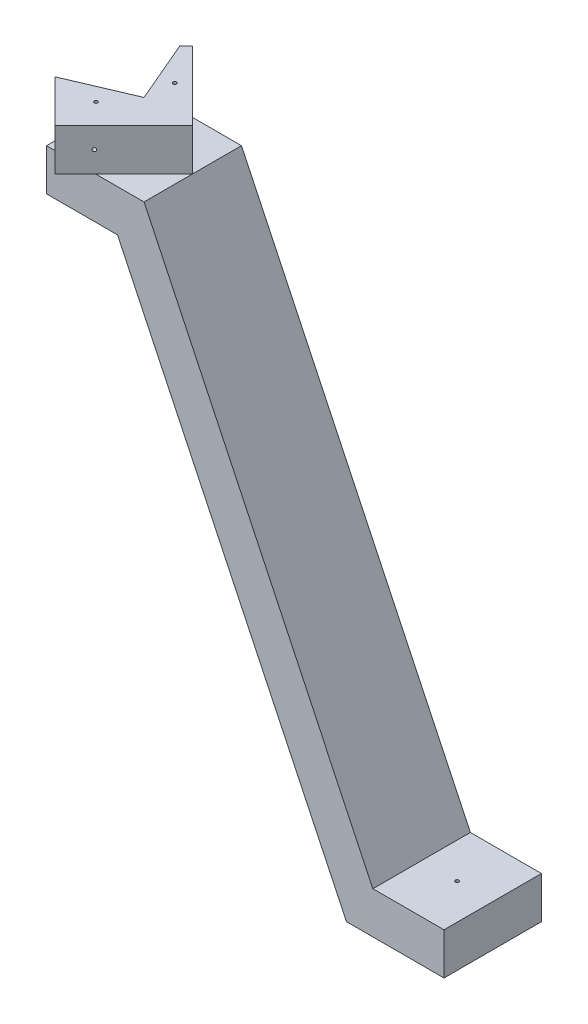
ISO-10303-21;
HEADER;
FILE_DESCRIPTION(('STEP AP214'),'2;1');
FILE_NAME('part.step','',(''),(''),'','','');
FILE_SCHEMA(('AUTOMOTIVE_DESIGN { 1 0 10303 214 1 1 1 1 }'));
ENDSEC;
DATA;
#1=APPLICATION_CONTEXT('core data for automotive mechanical design processes');
#2=APPLICATION_PROTOCOL_DEFINITION('international standard','automotive_design',2000,#1);
#3=PRODUCT_CONTEXT('',#1,'mechanical');
#4=PRODUCT('Part','Part','',(#3));
#5=PRODUCT_RELATED_PRODUCT_CATEGORY('part','',(#4));
#6=PRODUCT_DEFINITION_FORMATION('','',#4);
#7=PRODUCT_DEFINITION_CONTEXT('part definition',#1,'design');
#8=PRODUCT_DEFINITION('design','',#6,#7);
#9=PRODUCT_DEFINITION_SHAPE('','',#8);
#10=(LENGTH_UNIT() NAMED_UNIT(*) SI_UNIT(.MILLI.,.METRE.));
#11=(NAMED_UNIT(*) PLANE_ANGLE_UNIT() SI_UNIT($,.RADIAN.));
#12=(NAMED_UNIT(*) SI_UNIT($,.STERADIAN.) SOLID_ANGLE_UNIT());
#13=UNCERTAINTY_MEASURE_WITH_UNIT(LENGTH_MEASURE(1.E-05),#10,'distance_accuracy_value','');
#14=(GEOMETRIC_REPRESENTATION_CONTEXT(3) GLOBAL_UNCERTAINTY_ASSIGNED_CONTEXT((#13)) GLOBAL_UNIT_ASSIGNED_CONTEXT((#10,
#11,#12)) REPRESENTATION_CONTEXT('',''));
#15=CARTESIAN_POINT('',(0.,0.,0.));
#16=DIRECTION('',(0.,0.,1.));
#17=DIRECTION('',(1.,0.,0.));
#18=AXIS2_PLACEMENT_3D('',#15,#16,#17);
#19=CARTESIAN_POINT('',(-184.749471519788,476.25,44.45));
#20=DIRECTION('',(0.,-1.,0.));
#21=DIRECTION('',(0.,0.,-1.));
#22=AXIS2_PLACEMENT_3D('',#19,#20,#21);
#23=PLANE('',#22);
#24=DIRECTION('',(-0.707106781186549,0.,-0.707106781186546));
#25=VECTOR('',#24,1.);
#26=CARTESIAN_POINT('',(-247.611264367272,476.25,-62.8617928474839));
#27=LINE('',#26,#25);
#28=CARTESIAN_POINT('',(-184.749471519788,476.25,0.));
#29=VERTEX_POINT('',#28);
#30=CARTESIAN_POINT('',(-229.199471519788,476.25,-44.45));
#31=VERTEX_POINT('',#30);
#32=EDGE_CURVE('E69',#29,#31,#27,.T.);
#33=ORIENTED_EDGE('',*,*,#32,.F.);
#34=DIRECTION('',(0.,0.,-1.));
#35=VECTOR('',#34,1.);
#36=CARTESIAN_POINT('',(-184.749471519788,476.25,44.45));
#37=LINE('',#36,#35);
#38=CARTESIAN_POINT('',(-184.749471519788,476.25,-44.45));
#39=VERTEX_POINT('',#38);
#40=EDGE_CURVE('E334',#29,#39,#37,.T.);
#41=ORIENTED_EDGE('',*,*,#40,.T.);
#42=DIRECTION('',(-1.,0.,0.));
#43=VECTOR('',#42,1.);
#44=CARTESIAN_POINT('',(-184.749471519788,476.25,-44.45));
#45=LINE('',#44,#43);
#46=EDGE_CURVE('E310',#39,#31,#45,.T.);
#47=ORIENTED_EDGE('',*,*,#46,.T.);
#48=EDGE_LOOP('',(#33,#41,#47));
#49=FACE_BOUND('',#48,.T.);
#50=ADVANCED_FACE('F39',(#49),#23,.F.);
#51=DIRECTION('',(0.707106781186549,0.,-0.707106781186546));
#52=VECTOR('',#51,1.);
#53=CARTESIAN_POINT('',(-184.749471519788,476.25,0.));
#54=LINE('',#53,#52);
#55=CARTESIAN_POINT('',(-229.199471519788,476.25,44.45));
#56=VERTEX_POINT('',#55);
#57=EDGE_CURVE('E54',#56,#29,#54,.T.);
#58=ORIENTED_EDGE('',*,*,#57,.F.);
#59=DIRECTION('',(-1.,0.,0.));
#60=VECTOR('',#59,1.);
#61=CARTESIAN_POINT('',(-184.749471519788,476.25,44.45));
#62=LINE('',#61,#60);
#63=CARTESIAN_POINT('',(-184.749471519788,476.25,44.45));
#64=VERTEX_POINT('',#63);
#65=EDGE_CURVE('E281',#64,#56,#62,.T.);
#66=ORIENTED_EDGE('',*,*,#65,.F.);
#67=EDGE_CURVE('E335',#64,#29,#37,.T.);
#68=ORIENTED_EDGE('',*,*,#67,.T.);
#69=EDGE_LOOP('',(#58,#66,#68));
#70=FACE_BOUND('',#69,.T.);
#71=ADVANCED_FACE('F452',(#70),#23,.F.);
#72=DIRECTION('',(0.707106781186549,0.,0.707106781186546));
#73=VECTOR('',#72,1.);
#74=CARTESIAN_POINT('',(-247.611264367272,476.25,62.8617928474839));
#75=LINE('',#74,#73);
#76=CARTESIAN_POINT('',(-273.649471519788,476.25,36.8235856949683));
#77=VERTEX_POINT('',#76);
#78=CARTESIAN_POINT('',(-266.023057214756,476.25,44.45));
#79=VERTEX_POINT('',#78);
#80=EDGE_CURVE('E239',#77,#79,#75,.T.);
#81=ORIENTED_EDGE('',*,*,#80,.F.);
#82=DIRECTION('',(0.,0.,-1.));
#83=VECTOR('',#82,1.);
#84=CARTESIAN_POINT('',(-273.649471519788,476.25,44.45));
#85=LINE('',#84,#83);
#86=CARTESIAN_POINT('',(-273.649471519788,476.25,44.45));
#87=VERTEX_POINT('',#86);
#88=EDGE_CURVE('E330',#87,#77,#85,.T.);
#89=ORIENTED_EDGE('',*,*,#88,.F.);
#90=EDGE_CURVE('E280',#79,#87,#62,.T.);
#91=ORIENTED_EDGE('',*,*,#90,.F.);
#92=EDGE_LOOP('',(#81,#89,#91));
#93=FACE_BOUND('',#92,.T.);
#94=ADVANCED_FACE('F409',(#93),#23,.F.);
#95=CARTESIAN_POINT('',(88.9,0.,44.45));
#96=DIRECTION('',(0.,1.,0.));
#97=DIRECTION('',(0.,0.,1.));
#98=AXIS2_PLACEMENT_3D('',#95,#96,#97);
#99=PLANE('',#98);
#100=CARTESIAN_POINT('',(56.474328480212,0.,0.));
#101=DIRECTION('',(0.,1.,0.));
#102=DIRECTION('',(0.,0.,1.));
#103=AXIS2_PLACEMENT_3D('',#100,#101,#102);
#104=CIRCLE('',#103,1.58749999999999);
#105=CARTESIAN_POINT('',(56.474328480212,0.,1.58749999999999));
#106=VERTEX_POINT('',#105);
#107=EDGE_CURVE('E261',#106,#106,#104,.T.);
#108=ORIENTED_EDGE('',*,*,#107,.T.);
#109=EDGE_LOOP('',(#108));
#110=FACE_BOUND('',#109,.T.);
#111=DIRECTION('',(1.,0.,0.));
#112=VECTOR('',#111,1.);
#113=CARTESIAN_POINT('',(88.9,0.,-44.45));
#114=LINE('',#113,#112);
#115=CARTESIAN_POINT('',(0.,0.,-44.45));
#116=VERTEX_POINT('',#115);
#117=CARTESIAN_POINT('',(88.9,0.,-44.45));
#118=VERTEX_POINT('',#117);
#119=EDGE_CURVE('E265',#116,#118,#114,.T.);
#120=ORIENTED_EDGE('',*,*,#119,.T.);
#121=DIRECTION('',(0.,0.,-1.));
#122=VECTOR('',#121,1.);
#123=CARTESIAN_POINT('',(88.9,0.,44.45));
#124=LINE('',#123,#122);
#125=CARTESIAN_POINT('',(88.9,0.,44.45));
#126=VERTEX_POINT('',#125);
#127=EDGE_CURVE('E347',#126,#118,#124,.T.);
#128=ORIENTED_EDGE('',*,*,#127,.F.);
#129=DIRECTION('',(1.,0.,0.));
#130=VECTOR('',#129,1.);
#131=CARTESIAN_POINT('',(88.9,0.,44.45));
#132=LINE('',#131,#130);
#133=CARTESIAN_POINT('',(0.,0.,44.45));
#134=VERTEX_POINT('',#133);
#135=EDGE_CURVE('E266',#134,#126,#132,.T.);
#136=ORIENTED_EDGE('',*,*,#135,.F.);
#137=DIRECTION('',(0.,0.,-1.));
#138=VECTOR('',#137,1.);
#139=CARTESIAN_POINT('',(0.,0.,44.45));
#140=LINE('',#139,#138);
#141=EDGE_CURVE('E295',#134,#116,#140,.T.);
#142=ORIENTED_EDGE('',*,*,#141,.T.);
#143=EDGE_LOOP('',(#120,#128,#136,#142));
#144=FACE_BOUND('',#143,.T.);
#145=ADVANCED_FACE('F41',(#110,#144),#99,.F.);
#146=CARTESIAN_POINT('',(88.9,38.1,44.45));
#147=DIRECTION('',(-1.,0.,0.));
#148=DIRECTION('',(0.,0.,1.));
#149=AXIS2_PLACEMENT_3D('',#146,#147,#148);
#150=PLANE('',#149);
#151=DIRECTION('',(0.,1.,0.));
#152=VECTOR('',#151,1.);
#153=CARTESIAN_POINT('',(88.9,38.1,-44.45));
#154=LINE('',#153,#152);
#155=CARTESIAN_POINT('',(88.9,38.1,-44.45));
#156=VERTEX_POINT('',#155);
#157=EDGE_CURVE('E299',#118,#156,#154,.T.);
#158=ORIENTED_EDGE('',*,*,#157,.T.);
#159=DIRECTION('',(0.,0.,-1.));
#160=VECTOR('',#159,1.);
#161=CARTESIAN_POINT('',(88.9,38.1,44.45));
#162=LINE('',#161,#160);
#163=CARTESIAN_POINT('',(88.9,38.1,44.45));
#164=VERTEX_POINT('',#163);
#165=EDGE_CURVE('E343',#164,#156,#162,.T.);
#166=ORIENTED_EDGE('',*,*,#165,.F.);
#167=DIRECTION('',(0.,1.,0.));
#168=VECTOR('',#167,1.);
#169=CARTESIAN_POINT('',(88.9,38.1,44.45));
#170=LINE('',#169,#168);
#171=EDGE_CURVE('E270',#126,#164,#170,.T.);
#172=ORIENTED_EDGE('',*,*,#171,.F.);
#173=ORIENTED_EDGE('',*,*,#127,.T.);
#174=EDGE_LOOP('',(#158,#166,#172,#173));
#175=FACE_BOUND('',#174,.T.);
#176=ADVANCED_FACE('F441',(#175),#150,.F.);
#177=CARTESIAN_POINT('',(24.0486569604239,38.1,44.45));
#178=DIRECTION('',(0.,-1.,0.));
#179=DIRECTION('',(0.,0.,-1.));
#180=AXIS2_PLACEMENT_3D('',#177,#178,#179);
#181=PLANE('',#180);
#182=CARTESIAN_POINT('',(56.474328480212,38.1,0.));
#183=DIRECTION('',(0.,1.,0.));
#184=DIRECTION('',(0.,0.,1.));
#185=AXIS2_PLACEMENT_3D('',#182,#183,#184);
#186=CIRCLE('',#185,1.58749999999999);
#187=CARTESIAN_POINT('',(56.474328480212,38.1,1.58749999999999));
#188=VERTEX_POINT('',#187);
#189=EDGE_CURVE('E257',#188,#188,#186,.T.);
#190=ORIENTED_EDGE('',*,*,#189,.F.);
#191=EDGE_LOOP('',(#190));
#192=FACE_BOUND('',#191,.T.);
#193=DIRECTION('',(-1.,0.,0.));
#194=VECTOR('',#193,1.);
#195=CARTESIAN_POINT('',(24.0486569604239,38.1,-44.45));
#196=LINE('',#195,#194);
#197=CARTESIAN_POINT('',(24.0486569604239,38.1,-44.45));
#198=VERTEX_POINT('',#197);
#199=EDGE_CURVE('E302',#156,#198,#196,.T.);
#200=ORIENTED_EDGE('',*,*,#199,.T.);
#201=DIRECTION('',(0.,0.,-1.));
#202=VECTOR('',#201,1.);
#203=CARTESIAN_POINT('',(24.0486569604239,38.1,44.45));
#204=LINE('',#203,#202);
#205=CARTESIAN_POINT('',(24.0486569604239,38.1,44.45));
#206=VERTEX_POINT('',#205);
#207=EDGE_CURVE('E339',#206,#198,#204,.T.);
#208=ORIENTED_EDGE('',*,*,#207,.F.);
#209=DIRECTION('',(-1.,0.,0.));
#210=VECTOR('',#209,1.);
#211=CARTESIAN_POINT('',(24.0486569604239,38.1,44.45));
#212=LINE('',#211,#210);
#213=EDGE_CURVE('E274',#164,#206,#212,.T.);
#214=ORIENTED_EDGE('',*,*,#213,.F.);
#215=ORIENTED_EDGE('',*,*,#165,.T.);
#216=EDGE_LOOP('',(#200,#208,#214,#215));
#217=FACE_BOUND('',#216,.T.);
#218=ADVANCED_FACE('F444',(#192,#217),#181,.F.);
#219=CARTESIAN_POINT('',(-184.749471519788,476.25,44.45));
#220=DIRECTION('',(-0.902736301232063,-0.4301943403136,0.));
#221=DIRECTION('',(0.4301943403136,-0.902736301232063,0.));
#222=AXIS2_PLACEMENT_3D('',#219,#220,#221);
#223=PLANE('',#222);
#224=DIRECTION('',(-0.4301943403136,0.902736301232063,0.));
#225=VECTOR('',#224,1.);
#226=CARTESIAN_POINT('',(-184.749471519788,476.25,-44.45));
#227=LINE('',#226,#225);
#228=EDGE_CURVE('E305',#198,#39,#227,.T.);
#229=ORIENTED_EDGE('',*,*,#228,.T.);
#230=ORIENTED_EDGE('',*,*,#40,.F.);
#231=ORIENTED_EDGE('',*,*,#67,.F.);
#232=DIRECTION('',(-0.4301943403136,0.902736301232063,0.));
#233=VECTOR('',#232,1.);
#234=CARTESIAN_POINT('',(-184.749471519788,476.25,44.45));
#235=LINE('',#234,#233);
#236=EDGE_CURVE('E277',#206,#64,#235,.T.);
#237=ORIENTED_EDGE('',*,*,#236,.F.);
#238=ORIENTED_EDGE('',*,*,#207,.T.);
#239=EDGE_LOOP('',(#229,#230,#231,#237,#238));
#240=FACE_BOUND('',#239,.T.);
#241=ADVANCED_FACE('F449',(#240),#223,.F.);
#242=CARTESIAN_POINT('',(-273.649471519788,476.25,44.45));
#243=DIRECTION('',(1.,0.,0.));
#244=DIRECTION('',(0.,0.,-1.));
#245=AXIS2_PLACEMENT_3D('',#242,#243,#244);
#246=PLANE('',#245);
#247=CARTESIAN_POINT('',(-273.649471519788,476.25,18.9769560653847));
#248=VERTEX_POINT('',#247);
#249=EDGE_CURVE('E329',#77,#248,#85,.T.);
#250=ORIENTED_EDGE('',*,*,#249,.T.);
#251=DIRECTION('',(0.,-1.,0.));
#252=VECTOR('',#251,1.);
#253=CARTESIAN_POINT('',(-273.649471519788,476.25,18.9769560653847));
#254=LINE('',#253,#252);
#255=CARTESIAN_POINT('',(-273.649471519788,438.15,18.9769560653847));
#256=VERTEX_POINT('',#255);
#257=EDGE_CURVE('E211',#248,#256,#254,.T.);
#258=ORIENTED_EDGE('',*,*,#257,.T.);
#259=DIRECTION('',(0.,0.,-1.));
#260=VECTOR('',#259,1.);
#261=CARTESIAN_POINT('',(-273.649471519788,438.15,44.45));
#262=LINE('',#261,#260);
#263=CARTESIAN_POINT('',(-273.649471519788,438.15,44.45));
#264=VERTEX_POINT('',#263);
#265=EDGE_CURVE('E325',#264,#256,#262,.T.);
#266=ORIENTED_EDGE('',*,*,#265,.F.);
#267=DIRECTION('',(0.,-1.,0.));
#268=VECTOR('',#267,1.);
#269=CARTESIAN_POINT('',(-273.649471519788,476.25,44.45));
#270=LINE('',#269,#268);
#271=EDGE_CURVE('E285',#87,#264,#270,.T.);
#272=ORIENTED_EDGE('',*,*,#271,.F.);
#273=ORIENTED_EDGE('',*,*,#88,.T.);
#274=EDGE_LOOP('',(#250,#258,#266,#272,#273));
#275=FACE_BOUND('',#274,.T.);
#276=ADVANCED_FACE('F387',(#275),#246,.F.);
#277=CARTESIAN_POINT('',(-273.649471519788,438.15,44.45));
#278=DIRECTION('',(0.,1.,0.));
#279=DIRECTION('',(-1.,0.,0.));
#280=AXIS2_PLACEMENT_3D('',#277,#278,#279);
#281=PLANE('',#280);
#282=CARTESIAN_POINT('',(-247.611264367272,438.15,25.4));
#283=DIRECTION('',(0.,-1.,0.));
#284=DIRECTION('',(0.,0.,-1.));
#285=AXIS2_PLACEMENT_3D('',#282,#283,#284);
#286=CIRCLE('',#285,1.58749999999999);
#287=CARTESIAN_POINT('',(-247.611264367272,438.15,23.8125));
#288=VERTEX_POINT('',#287);
#289=EDGE_CURVE('E375',#288,#288,#286,.T.);
#290=ORIENTED_EDGE('',*,*,#289,.F.);
#291=EDGE_LOOP('',(#290));
#292=FACE_BOUND('',#291,.T.);
#293=CARTESIAN_POINT('',(-226.578128480212,438.15,-25.4));
#294=DIRECTION('',(0.,-1.,0.));
#295=DIRECTION('',(0.,0.,-1.));
#296=AXIS2_PLACEMENT_3D('',#293,#294,#295);
#297=CIRCLE('',#296,1.58749999999999);
#298=CARTESIAN_POINT('',(-226.578128480212,438.15,-26.9875));
#299=VERTEX_POINT('',#298);
#300=EDGE_CURVE('E365',#299,#299,#297,.T.);
#301=ORIENTED_EDGE('',*,*,#300,.F.);
#302=EDGE_LOOP('',(#301));
#303=FACE_BOUND('',#302,.T.);
#304=ORIENTED_EDGE('',*,*,#265,.T.);
#305=DIRECTION('',(0.919691342834383,0.,-0.392642119385438));
#306=VECTOR('',#305,1.);
#307=CARTESIAN_POINT('',(-282.84803115672,438.15,22.9040800720184));
#308=LINE('',#307,#306);
#309=CARTESIAN_POINT('',(-229.199471519788,438.15,0.));
#310=VERTEX_POINT('',#309);
#311=EDGE_CURVE('E215',#256,#310,#308,.T.);
#312=ORIENTED_EDGE('',*,*,#311,.T.);
#313=DIRECTION('',(-0.392642119385441,0.,-0.919691342834382));
#314=VECTOR('',#313,1.);
#315=CARTESIAN_POINT('',(-220.000911882857,438.15,21.5459199279814));
#316=LINE('',#315,#314);
#317=CARTESIAN_POINT('',(-248.176427585173,438.15,-44.45));
#318=VERTEX_POINT('',#317);
#319=EDGE_CURVE('E170',#310,#318,#316,.T.);
#320=ORIENTED_EDGE('',*,*,#319,.T.);
#321=DIRECTION('',(1.,0.,0.));
#322=VECTOR('',#321,1.);
#323=CARTESIAN_POINT('',(-273.649471519788,438.15,-44.45));
#324=LINE('',#323,#322);
#325=CARTESIAN_POINT('',(-208.798128480212,438.15,-44.45));
#326=VERTEX_POINT('',#325);
#327=EDGE_CURVE('E313',#318,#326,#324,.T.);
#328=ORIENTED_EDGE('',*,*,#327,.T.);
#329=DIRECTION('',(0.,0.,-1.));
#330=VECTOR('',#329,1.);
#331=CARTESIAN_POINT('',(-208.798128480212,438.15,44.45));
#332=LINE('',#331,#330);
#333=CARTESIAN_POINT('',(-208.798128480212,438.15,44.45));
#334=VERTEX_POINT('',#333);
#335=EDGE_CURVE('E321',#334,#326,#332,.T.);
#336=ORIENTED_EDGE('',*,*,#335,.F.);
#337=DIRECTION('',(1.,0.,0.));
#338=VECTOR('',#337,1.);
#339=CARTESIAN_POINT('',(-273.649471519788,438.15,44.45));
#340=LINE('',#339,#338);
#341=EDGE_CURVE('E289',#264,#334,#340,.T.);
#342=ORIENTED_EDGE('',*,*,#341,.F.);
#343=EDGE_LOOP('',(#304,#312,#320,#328,#336,#342));
#344=FACE_BOUND('',#343,.T.);
#345=ADVANCED_FACE('F383',(#292,#303,#344),#281,.F.);
#346=CARTESIAN_POINT('',(0.,0.,44.45));
#347=DIRECTION('',(0.902736301232063,0.4301943403136,0.));
#348=DIRECTION('',(-0.4301943403136,0.902736301232063,0.));
#349=AXIS2_PLACEMENT_3D('',#346,#347,#348);
#350=PLANE('',#349);
#351=DIRECTION('',(0.4301943403136,-0.902736301232063,0.));
#352=VECTOR('',#351,1.);
#353=CARTESIAN_POINT('',(0.,0.,-44.45));
#354=LINE('',#353,#352);
#355=EDGE_CURVE('E271',#326,#116,#354,.T.);
#356=ORIENTED_EDGE('',*,*,#355,.T.);
#357=ORIENTED_EDGE('',*,*,#141,.F.);
#358=DIRECTION('',(0.4301943403136,-0.902736301232063,0.));
#359=VECTOR('',#358,1.);
#360=CARTESIAN_POINT('',(0.,0.,44.45));
#361=LINE('',#360,#359);
#362=EDGE_CURVE('E292',#334,#134,#361,.T.);
#363=ORIENTED_EDGE('',*,*,#362,.F.);
#364=ORIENTED_EDGE('',*,*,#335,.T.);
#365=EDGE_LOOP('',(#356,#357,#363,#364));
#366=FACE_BOUND('',#365,.T.);
#367=ADVANCED_FACE('F386',(#366),#350,.F.);
#368=CARTESIAN_POINT('',(0.,0.,44.45));
#369=DIRECTION('',(0.,0.,1.));
#370=DIRECTION('',(1.,0.,0.));
#371=AXIS2_PLACEMENT_3D('',#368,#369,#370);
#372=PLANE('',#371);
#373=ORIENTED_EDGE('',*,*,#135,.T.);
#374=ORIENTED_EDGE('',*,*,#171,.T.);
#375=ORIENTED_EDGE('',*,*,#213,.T.);
#376=ORIENTED_EDGE('',*,*,#236,.T.);
#377=ORIENTED_EDGE('',*,*,#65,.T.);
#378=EDGE_CURVE('E286',#56,#79,#62,.T.);
#379=ORIENTED_EDGE('',*,*,#378,.T.);
#380=ORIENTED_EDGE('',*,*,#90,.T.);
#381=ORIENTED_EDGE('',*,*,#271,.T.);
#382=ORIENTED_EDGE('',*,*,#341,.T.);
#383=ORIENTED_EDGE('',*,*,#362,.T.);
#384=EDGE_LOOP('',(#373,#374,#375,#376,#377,#379,#380,#381,#382,#383));
#385=FACE_BOUND('',#384,.T.);
#386=ADVANCED_FACE('F427',(#385),#372,.T.);
#387=CARTESIAN_POINT('',(0.,0.,-44.45));
#388=DIRECTION('',(0.,0.,1.));
#389=DIRECTION('',(1.,0.,0.));
#390=AXIS2_PLACEMENT_3D('',#387,#388,#389);
#391=PLANE('',#390);
#392=ORIENTED_EDGE('',*,*,#327,.F.);
#393=DIRECTION('',(0.,1.,0.));
#394=VECTOR('',#393,1.);
#395=CARTESIAN_POINT('',(-248.176427585173,0.,-44.45));
#396=LINE('',#395,#394);
#397=CARTESIAN_POINT('',(-248.176427585173,476.25,-44.45));
#398=VERTEX_POINT('',#397);
#399=EDGE_CURVE('E200',#318,#398,#396,.T.);
#400=ORIENTED_EDGE('',*,*,#399,.T.);
#401=EDGE_CURVE('E309',#31,#398,#45,.T.);
#402=ORIENTED_EDGE('',*,*,#401,.F.);
#403=ORIENTED_EDGE('',*,*,#46,.F.);
#404=ORIENTED_EDGE('',*,*,#228,.F.);
#405=ORIENTED_EDGE('',*,*,#199,.F.);
#406=ORIENTED_EDGE('',*,*,#157,.F.);
#407=ORIENTED_EDGE('',*,*,#119,.F.);
#408=ORIENTED_EDGE('',*,*,#355,.F.);
#409=EDGE_LOOP('',(#392,#400,#402,#403,#404,#405,#406,#407,#408));
#410=FACE_BOUND('',#409,.T.);
#411=ADVANCED_FACE('F465',(#410),#391,.F.);
#412=CARTESIAN_POINT('',(56.474328480212,38.1,0.));
#413=DIRECTION('',(0.,1.,0.));
#414=DIRECTION('',(0.,0.,1.));
#415=AXIS2_PLACEMENT_3D('',#412,#413,#414);
#416=CYLINDRICAL_SURFACE('',#415,1.58749999999999);
#417=ORIENTED_EDGE('',*,*,#107,.F.);
#418=EDGE_LOOP('',(#417));
#419=FACE_BOUND('',#418,.T.);
#420=ORIENTED_EDGE('',*,*,#189,.T.);
#421=EDGE_LOOP('',(#420));
#422=FACE_BOUND('',#421,.T.);
#423=ADVANCED_FACE('F486',(#419,#422),#416,.F.);
#424=CARTESIAN_POINT('',(0.,476.25,0.));
#425=DIRECTION('',(0.,-1.,0.));
#426=DIRECTION('',(0.,0.,-1.));
#427=AXIS2_PLACEMENT_3D('',#424,#425,#426);
#428=PLANE('',#427);
#429=DIRECTION('',(-0.919691342834383,0.,0.392642119385438));
#430=VECTOR('',#429,1.);
#431=CARTESIAN_POINT('',(-35.3351860587805,476.25,-82.7661198614339));
#432=LINE('',#431,#430);
#433=CARTESIAN_POINT('',(-286.156499071563,476.25,24.3165581431933));
#434=VERTEX_POINT('',#433);
#435=EDGE_CURVE('E208',#248,#434,#432,.T.);
#436=ORIENTED_EDGE('',*,*,#435,.F.);
#437=ORIENTED_EDGE('',*,*,#249,.F.);
#438=EDGE_CURVE('E235',#434,#77,#75,.T.);
#439=ORIENTED_EDGE('',*,*,#438,.F.);
#440=EDGE_LOOP('',(#436,#437,#439));
#441=FACE_BOUND('',#440,.T.);
#442=ADVANCED_FACE('F401',(#441),#428,.T.);
#443=ORIENTED_EDGE('',*,*,#378,.F.);
#444=CARTESIAN_POINT('',(-247.611264367272,476.25,62.8617928474839));
#445=VERTEX_POINT('',#444);
#446=EDGE_CURVE('E238',#445,#56,#54,.T.);
#447=ORIENTED_EDGE('',*,*,#446,.F.);
#448=EDGE_CURVE('E234',#79,#445,#75,.T.);
#449=ORIENTED_EDGE('',*,*,#448,.F.);
#450=EDGE_LOOP('',(#443,#447,#449));
#451=FACE_BOUND('',#450,.T.);
#452=ADVANCED_FACE('F423',(#451),#428,.T.);
#453=CARTESIAN_POINT('',(-310.473057214756,514.35,0.));
#454=DIRECTION('',(0.707106781186546,0.,0.707106781186549));
#455=DIRECTION('',(0.707106781186549,0.,-0.707106781186546));
#456=AXIS2_PLACEMENT_3D('',#453,#454,#455);
#457=PLANE('',#456);
#458=DIRECTION('',(-0.707106781186549,0.,0.707106781186546));
#459=VECTOR('',#458,1.);
#460=CARTESIAN_POINT('',(-310.473057214756,476.25,0.));
#461=LINE('',#460,#459);
#462=CARTESIAN_POINT('',(-247.611264367272,476.25,-62.8617928474839));
#463=VERTEX_POINT('',#462);
#464=CARTESIAN_POINT('',(-253.516029662981,476.25,-56.9570275517748));
#465=VERTEX_POINT('',#464);
#466=EDGE_CURVE('E218',#463,#465,#461,.T.);
#467=ORIENTED_EDGE('',*,*,#466,.T.);
#468=DIRECTION('',(0.,1.,0.));
#469=VECTOR('',#468,1.);
#470=CARTESIAN_POINT('',(-253.516029662981,514.35,-56.9570275517748));
#471=LINE('',#470,#469);
#472=CARTESIAN_POINT('',(-253.516029662981,514.35,-56.9570275517748));
#473=VERTEX_POINT('',#472);
#474=EDGE_CURVE('E61',#465,#473,#471,.T.);
#475=ORIENTED_EDGE('',*,*,#474,.T.);
#476=DIRECTION('',(-0.707106781186549,0.,0.707106781186546));
#477=VECTOR('',#476,1.);
#478=CARTESIAN_POINT('',(-310.473057214756,514.35,0.));
#479=LINE('',#478,#477);
#480=CARTESIAN_POINT('',(-247.611264367272,514.35,-62.8617928474839));
#481=VERTEX_POINT('',#480);
#482=EDGE_CURVE('E187',#481,#473,#479,.T.);
#483=ORIENTED_EDGE('',*,*,#482,.F.);
#484=DIRECTION('',(0.,-1.,0.));
#485=VECTOR('',#484,1.);
#486=CARTESIAN_POINT('',(-247.611264367272,514.35,-62.8617928474839));
#487=LINE('',#486,#485);
#488=EDGE_CURVE('E230',#481,#463,#487,.T.);
#489=ORIENTED_EDGE('',*,*,#488,.T.);
#490=EDGE_LOOP('',(#467,#475,#483,#489));
#491=FACE_BOUND('',#490,.T.);
#492=ADVANCED_FACE('F460',(#491),#457,.F.);
#493=CARTESIAN_POINT('',(-247.611264367272,514.35,62.8617928474839));
#494=DIRECTION('',(0.707106781186546,0.,-0.707106781186549));
#495=DIRECTION('',(-0.707106781186549,0.,-0.707106781186546));
#496=AXIS2_PLACEMENT_3D('',#493,#494,#495);
#497=PLANE('',#496);
#498=DIRECTION('',(0.707106781186549,0.,0.707106781186546));
#499=VECTOR('',#498,1.);
#500=CARTESIAN_POINT('',(-247.611264367272,514.35,62.8617928474839));
#501=LINE('',#500,#499);
#502=CARTESIAN_POINT('',(-286.156499071563,514.35,24.3165581431933));
#503=VERTEX_POINT('',#502);
#504=CARTESIAN_POINT('',(-247.611264367272,514.35,62.8617928474839));
#505=VERTEX_POINT('',#504);
#506=EDGE_CURVE('E221',#503,#505,#501,.T.);
#507=ORIENTED_EDGE('',*,*,#506,.F.);
#508=DIRECTION('',(0.,-1.,0.));
#509=VECTOR('',#508,1.);
#510=CARTESIAN_POINT('',(-286.156499071563,514.35,24.3165581431933));
#511=LINE('',#510,#509);
#512=EDGE_CURVE('E179',#503,#434,#511,.T.);
#513=ORIENTED_EDGE('',*,*,#512,.T.);
#514=ORIENTED_EDGE('',*,*,#438,.T.);
#515=ORIENTED_EDGE('',*,*,#80,.T.);
#516=ORIENTED_EDGE('',*,*,#448,.T.);
#517=DIRECTION('',(0.,-1.,0.));
#518=VECTOR('',#517,1.);
#519=CARTESIAN_POINT('',(-247.611264367272,514.35,62.8617928474839));
#520=LINE('',#519,#518);
#521=EDGE_CURVE('E253',#505,#445,#520,.T.);
#522=ORIENTED_EDGE('',*,*,#521,.F.);
#523=EDGE_LOOP('',(#507,#513,#514,#515,#516,#522));
#524=FACE_BOUND('',#523,.T.);
#525=ADVANCED_FACE('F405',(#524),#497,.F.);
#526=CARTESIAN_POINT('',(-184.749471519788,514.35,0.));
#527=DIRECTION('',(-0.707106781186546,0.,-0.707106781186549));
#528=DIRECTION('',(-0.707106781186549,0.,0.707106781186546));
#529=AXIS2_PLACEMENT_3D('',#526,#527,#528);
#530=PLANE('',#529);
#531=CARTESIAN_POINT('',(-229.650752125134,495.3,44.9012806053456));
#532=DIRECTION('',(0.707106781186546,0.,0.707106781186549));
#533=DIRECTION('',(0.707106781186549,0.,-0.707106781186546));
#534=AXIS2_PLACEMENT_3D('',#531,#532,#533);
#535=CIRCLE('',#534,1.58749999999996);
#536=CARTESIAN_POINT('',(-228.52822011,495.3,43.778748590212));
#537=VERTEX_POINT('',#536);
#538=EDGE_CURVE('E193',#537,#537,#535,.T.);
#539=ORIENTED_EDGE('',*,*,#538,.F.);
#540=EDGE_LOOP('',(#539));
#541=FACE_BOUND('',#540,.T.);
#542=ORIENTED_EDGE('',*,*,#446,.T.);
#543=ORIENTED_EDGE('',*,*,#57,.T.);
#544=DIRECTION('',(0.,-1.,0.));
#545=VECTOR('',#544,1.);
#546=CARTESIAN_POINT('',(-184.749471519788,514.35,0.));
#547=LINE('',#546,#545);
#548=CARTESIAN_POINT('',(-184.749471519788,514.35,0.));
#549=VERTEX_POINT('',#548);
#550=EDGE_CURVE('E249',#549,#29,#547,.T.);
#551=ORIENTED_EDGE('',*,*,#550,.F.);
#552=DIRECTION('',(0.707106781186549,0.,-0.707106781186546));
#553=VECTOR('',#552,1.);
#554=CARTESIAN_POINT('',(-184.749471519788,514.35,0.));
#555=LINE('',#554,#553);
#556=EDGE_CURVE('E224',#505,#549,#555,.T.);
#557=ORIENTED_EDGE('',*,*,#556,.F.);
#558=ORIENTED_EDGE('',*,*,#521,.T.);
#559=EDGE_LOOP('',(#542,#543,#551,#557,#558));
#560=FACE_BOUND('',#559,.T.);
#561=ADVANCED_FACE('F421',(#541,#560),#530,.F.);
#562=CARTESIAN_POINT('',(-247.611264367272,514.35,-62.8617928474839));
#563=DIRECTION('',(-0.707106781186546,0.,0.707106781186549));
#564=DIRECTION('',(0.707106781186549,0.,0.707106781186546));
#565=AXIS2_PLACEMENT_3D('',#562,#563,#564);
#566=PLANE('',#565);
#567=CARTESIAN_POINT('',(-229.650752125134,495.3,-44.9012806053456));
#568=DIRECTION('',(0.707106781186546,0.,-0.707106781186549));
#569=DIRECTION('',(-0.707106781186549,0.,-0.707106781186546));
#570=AXIS2_PLACEMENT_3D('',#567,#568,#569);
#571=CIRCLE('',#570,1.58749999999996);
#572=CARTESIAN_POINT('',(-230.773284140268,495.3,-46.0238126204793));
#573=VERTEX_POINT('',#572);
#574=EDGE_CURVE('E353',#573,#573,#571,.T.);
#575=ORIENTED_EDGE('',*,*,#574,.F.);
#576=EDGE_LOOP('',(#575));
#577=FACE_BOUND('',#576,.T.);
#578=ORIENTED_EDGE('',*,*,#32,.T.);
#579=EDGE_CURVE('E243',#31,#463,#27,.T.);
#580=ORIENTED_EDGE('',*,*,#579,.T.);
#581=ORIENTED_EDGE('',*,*,#488,.F.);
#582=DIRECTION('',(-0.707106781186549,0.,-0.707106781186546));
#583=VECTOR('',#582,1.);
#584=CARTESIAN_POINT('',(-247.611264367272,514.35,-62.8617928474839));
#585=LINE('',#584,#583);
#586=EDGE_CURVE('E227',#549,#481,#585,.T.);
#587=ORIENTED_EDGE('',*,*,#586,.F.);
#588=ORIENTED_EDGE('',*,*,#550,.T.);
#589=EDGE_LOOP('',(#578,#580,#581,#587,#588));
#590=FACE_BOUND('',#589,.T.);
#591=ADVANCED_FACE('F455',(#577,#590),#566,.F.);
#592=CARTESIAN_POINT('',(0.,514.35,0.));
#593=DIRECTION('',(0.,-1.,0.));
#594=DIRECTION('',(0.,0.,-1.));
#595=AXIS2_PLACEMENT_3D('',#592,#593,#594);
#596=PLANE('',#595);
#597=CARTESIAN_POINT('',(-247.611264367272,514.35,25.4));
#598=DIRECTION('',(0.,-1.,0.));
#599=DIRECTION('',(0.,0.,-1.));
#600=AXIS2_PLACEMENT_3D('',#597,#598,#599);
#601=CIRCLE('',#600,1.58749999999999);
#602=CARTESIAN_POINT('',(-247.611264367272,514.35,23.8125));
#603=VERTEX_POINT('',#602);
#604=EDGE_CURVE('E371',#603,#603,#601,.T.);
#605=ORIENTED_EDGE('',*,*,#604,.T.);
#606=EDGE_LOOP('',(#605));
#607=FACE_BOUND('',#606,.T.);
#608=CARTESIAN_POINT('',(-226.578128480212,514.35,-25.4));
#609=DIRECTION('',(0.,-1.,0.));
#610=DIRECTION('',(0.,0.,-1.));
#611=AXIS2_PLACEMENT_3D('',#608,#609,#610);
#612=CIRCLE('',#611,1.58749999999999);
#613=CARTESIAN_POINT('',(-226.578128480212,514.35,-26.9875));
#614=VERTEX_POINT('',#613);
#615=EDGE_CURVE('E360',#614,#614,#612,.T.);
#616=ORIENTED_EDGE('',*,*,#615,.T.);
#617=EDGE_LOOP('',(#616));
#618=FACE_BOUND('',#617,.T.);
#619=DIRECTION('',(0.392642119385442,0.,0.919691342834382));
#620=VECTOR('',#619,1.);
#621=CARTESIAN_POINT('',(-229.199471519788,514.35,0.));
#622=LINE('',#621,#620);
#623=CARTESIAN_POINT('',(-229.199471519788,514.35,0.));
#624=VERTEX_POINT('',#623);
#625=EDGE_CURVE('E168',#473,#624,#622,.T.);
#626=ORIENTED_EDGE('',*,*,#625,.T.);
#627=DIRECTION('',(-0.919691342834383,0.,0.392642119385438));
#628=VECTOR('',#627,1.);
#629=CARTESIAN_POINT('',(-310.473057214756,514.35,34.6979812150662));
#630=LINE('',#629,#628);
#631=EDGE_CURVE('E174',#624,#503,#630,.T.);
#632=ORIENTED_EDGE('',*,*,#631,.T.);
#633=ORIENTED_EDGE('',*,*,#506,.T.);
#634=ORIENTED_EDGE('',*,*,#556,.T.);
#635=ORIENTED_EDGE('',*,*,#586,.T.);
#636=ORIENTED_EDGE('',*,*,#482,.T.);
#637=EDGE_LOOP('',(#626,#632,#633,#634,#635,#636));
#638=FACE_BOUND('',#637,.T.);
#639=ADVANCED_FACE('F185',(#607,#618,#638),#596,.F.);
#640=DIRECTION('',(0.392642119385441,0.,0.919691342834382));
#641=VECTOR('',#640,1.);
#642=CARTESIAN_POINT('',(-193.864285461007,476.25,82.7661198614344));
#643=LINE('',#642,#641);
#644=EDGE_CURVE('E11',#465,#398,#643,.T.);
#645=ORIENTED_EDGE('',*,*,#644,.F.);
#646=ORIENTED_EDGE('',*,*,#466,.F.);
#647=ORIENTED_EDGE('',*,*,#579,.F.);
#648=ORIENTED_EDGE('',*,*,#401,.T.);
#649=EDGE_LOOP('',(#645,#646,#647,#648));
#650=FACE_BOUND('',#649,.T.);
#651=ADVANCED_FACE('F462',(#650),#428,.T.);
#652=CARTESIAN_POINT('',(-310.473057214756,514.35,34.6979812150662));
#653=DIRECTION('',(0.392642119385438,0.,0.919691342834383));
#654=DIRECTION('',(0.919691342834383,0.,-0.392642119385438));
#655=AXIS2_PLACEMENT_3D('',#652,#653,#654);
#656=PLANE('',#655);
#657=CARTESIAN_POINT('',(-260.982824700683,495.3,13.5692080297964));
#658=DIRECTION('',(0.392642119385438,0.,0.919691342834383));
#659=DIRECTION('',(0.919691342834383,0.,-0.392642119385438));
#660=AXIS2_PLACEMENT_3D('',#657,#658,#659);
#661=ELLIPSE('',#660,1.71074204453317,1.58749999999996);
#662=CARTESIAN_POINT('',(-259.409470052503,495.3,12.8974986477091));
#663=VERTEX_POINT('',#662);
#664=EDGE_CURVE('E189',#663,#663,#661,.T.);
#665=ORIENTED_EDGE('',*,*,#664,.T.);
#666=EDGE_LOOP('',(#665));
#667=FACE_BOUND('',#666,.T.);
#668=ORIENTED_EDGE('',*,*,#257,.F.);
#669=ORIENTED_EDGE('',*,*,#435,.T.);
#670=ORIENTED_EDGE('',*,*,#512,.F.);
#671=ORIENTED_EDGE('',*,*,#631,.F.);
#672=DIRECTION('',(0.,-1.,0.));
#673=VECTOR('',#672,1.);
#674=CARTESIAN_POINT('',(-229.199471519788,514.35,0.));
#675=LINE('',#674,#673);
#676=EDGE_CURVE('E164',#624,#310,#675,.T.);
#677=ORIENTED_EDGE('',*,*,#676,.T.);
#678=ORIENTED_EDGE('',*,*,#311,.F.);
#679=EDGE_LOOP('',(#668,#669,#670,#671,#677,#678));
#680=FACE_BOUND('',#679,.T.);
#681=ADVANCED_FACE('F177',(#667,#680),#656,.F.);
#682=CARTESIAN_POINT('',(-229.199471519788,514.35,0.));
#683=DIRECTION('',(0.919691342834382,0.,-0.392642119385441));
#684=DIRECTION('',(-0.392642119385441,0.,-0.919691342834382));
#685=AXIS2_PLACEMENT_3D('',#682,#683,#684);
#686=PLANE('',#685);
#687=CARTESIAN_POINT('',(-242.768679549585,495.3,-31.783353180895));
#688=DIRECTION('',(0.919691342834382,0.,-0.392642119385441));
#689=DIRECTION('',(-0.392642119385442,0.,-0.919691342834382));
#690=AXIS2_PLACEMENT_3D('',#687,#688,#689);
#691=ELLIPSE('',#690,1.71074204453317,1.58749999999996);
#692=CARTESIAN_POINT('',(-243.440388931672,495.3,-33.3567078290749));
#693=VERTEX_POINT('',#692);
#694=EDGE_CURVE('E350',#693,#693,#691,.T.);
#695=ORIENTED_EDGE('',*,*,#694,.T.);
#696=EDGE_LOOP('',(#695));
#697=FACE_BOUND('',#696,.T.);
#698=ORIENTED_EDGE('',*,*,#676,.F.);
#699=ORIENTED_EDGE('',*,*,#625,.F.);
#700=ORIENTED_EDGE('',*,*,#474,.F.);
#701=ORIENTED_EDGE('',*,*,#644,.T.);
#702=ORIENTED_EDGE('',*,*,#399,.F.);
#703=ORIENTED_EDGE('',*,*,#319,.F.);
#704=EDGE_LOOP('',(#698,#699,#700,#701,#702,#703));
#705=FACE_BOUND('',#704,.T.);
#706=ADVANCED_FACE('F166',(#697,#705),#686,.F.);
#707=CARTESIAN_POINT('',(-229.650752125134,495.3,44.9012806053456));
#708=DIRECTION('',(0.707106781186546,0.,0.707106781186549));
#709=DIRECTION('',(0.707106781186549,0.,-0.707106781186546));
#710=AXIS2_PLACEMENT_3D('',#707,#708,#709);
#711=CYLINDRICAL_SURFACE('',#710,1.58749999999996);
#712=CARTESIAN_POINT('',(-248.324982392254,495.3,23.9819863079586));
#713=CARTESIAN_POINT('',(-248.324981550961,495.388056329875,23.9819867780636));
#714=CARTESIAN_POINT('',(-248.331940324602,495.476109348789,23.9854251001471));
#715=CARTESIAN_POINT('',(-248.359001659657,495.649588679534,23.9995460329104));
#716=CARTESIAN_POINT('',(-248.3791102998,495.735013757425,24.010231994009));
#717=CARTESIAN_POINT('',(-248.430395911305,495.900732763549,24.0398357291558));
#718=CARTESIAN_POINT('',(-248.461548178198,495.981037676262,24.0587351509315));
#719=CARTESIAN_POINT('',(-248.532234359622,496.134861872494,24.1062534715961));
#720=CARTESIAN_POINT('',(-248.571772827849,496.208377438149,24.1348776561213));
#721=CARTESIAN_POINT('',(-248.656963810403,496.348243957776,24.2042777323283));
#722=CARTESIAN_POINT('',(-248.702733104817,496.414398344757,24.2453106199202));
#723=CARTESIAN_POINT('',(-248.7954916844,496.535257235771,24.3406811238938));
#724=CARTESIAN_POINT('',(-248.842478728425,496.589981297807,24.3949956629601));
#725=CARTESIAN_POINT('',(-248.927210554972,496.679989448877,24.5095661307742));
#726=CARTESIAN_POINT('',(-248.965381680393,496.716835666205,24.5682729853664));
#727=CARTESIAN_POINT('',(-249.035343119091,496.779242439883,24.6947651858741));
#728=CARTESIAN_POINT('',(-249.067139168129,496.804813166052,24.7625422787461));
#729=CARTESIAN_POINT('',(-249.117567525492,496.84216325569,24.8945497815718));
#730=CARTESIAN_POINT('',(-249.137428335318,496.855385994221,24.9579156958719));
#731=CARTESIAN_POINT('',(-249.16916304813,496.874779526587,25.0876424060545));
#732=CARTESIAN_POINT('',(-249.181035187885,496.880948763806,25.1540038596559));
#733=CARTESIAN_POINT('',(-249.19649749299,496.887769884628,25.2902144294739));
#734=CARTESIAN_POINT('',(-249.199792791619,496.888227336975,25.3601054623569));
#735=CARTESIAN_POINT('',(-249.197174449767,496.884938269864,25.4996036155896));
#736=CARTESIAN_POINT('',(-249.191256088696,496.881189595686,25.5692105720712));
#737=CARTESIAN_POINT('',(-249.168727494381,496.870526619534,25.7177411053852));
#738=CARTESIAN_POINT('',(-249.1505785582,496.863206374334,25.7964031524555));
#739=CARTESIAN_POINT('',(-249.102602077033,496.84799973553,25.9500502625604));
#740=CARTESIAN_POINT('',(-249.072767153353,496.840112986803,26.0250329686821));
#741=CARTESIAN_POINT('',(-248.998107818276,496.825296618551,26.1776872845394));
#742=CARTESIAN_POINT('',(-248.952002370346,496.818565550009,26.2547584531399));
#743=CARTESIAN_POINT('',(-248.847321491887,496.80949084286,26.4001679273229));
#744=CARTESIAN_POINT('',(-248.788752825218,496.807144831189,26.4685109376627));
#745=CARTESIAN_POINT('',(-248.663186943088,496.807603935634,26.5920998735175));
#746=CARTESIAN_POINT('',(-248.596558607066,496.810230787603,26.6477218894485));
#747=CARTESIAN_POINT('',(-248.455321068575,496.819460706074,26.7472925881293));
#748=CARTESIAN_POINT('',(-248.380708709678,496.826065349981,26.7912366299798));
#749=CARTESIAN_POINT('',(-248.225629645523,496.841182497057,26.8663315556058));
#750=CARTESIAN_POINT('',(-248.145170886598,496.849692442161,26.8974994353338));
#751=CARTESIAN_POINT('',(-247.980130794472,496.86580947443,26.9464496459224));
#752=CARTESIAN_POINT('',(-247.895546995873,496.873416012093,26.9642238648115));
#753=CARTESIAN_POINT('',(-247.720878329116,496.884672337943,26.9862493819952));
#754=CARTESIAN_POINT('',(-247.630708350014,496.88815316801,26.9899361779896));
#755=CARTESIAN_POINT('',(-247.451128901376,496.886647247846,26.9819451279591));
#756=CARTESIAN_POINT('',(-247.361718421399,496.881674479529,26.9702926596593));
#757=CARTESIAN_POINT('',(-247.198075319763,496.861003876809,26.9347874017407));
#758=CARTESIAN_POINT('',(-247.123316293668,496.846678530426,26.9125839087484));
#759=CARTESIAN_POINT('',(-246.980399009766,496.807072641723,26.8587594797398));
#760=CARTESIAN_POINT('',(-246.912234616421,496.781802404628,26.8271474111595));
#761=CARTESIAN_POINT('',(-246.794128215171,496.724424268106,26.7624703353555));
#762=CARTESIAN_POINT('',(-246.742974594254,496.693814121394,26.7302619336445));
#763=CARTESIAN_POINT('',(-246.648149852338,496.624802109166,26.6633038239655));
#764=CARTESIAN_POINT('',(-246.604480399855,496.586398510341,26.6285535517721));
#765=CARTESIAN_POINT('',(-246.523525275368,496.501324763199,26.5575733111234));
#766=CARTESIAN_POINT('',(-246.4864887418,496.454429322038,26.5213315880218));
#767=CARTESIAN_POINT('',(-246.420129958653,496.354320520945,26.4505767248286));
#768=CARTESIAN_POINT('',(-246.390811610925,496.301103985101,26.4160644661606));
#769=CARTESIAN_POINT('',(-246.335095612786,496.180570222215,26.3454527758993));
#770=CARTESIAN_POINT('',(-246.309881455163,496.112351412286,26.3099565867865));
#771=CARTESIAN_POINT('',(-246.267530844049,495.970243705238,26.2461709856371));
#772=CARTESIAN_POINT('',(-246.250399599668,495.896351187209,26.2178862264554));
#773=CARTESIAN_POINT('',(-246.221576262605,495.73595746243,26.1680189604361));
#774=CARTESIAN_POINT('',(-246.210695599003,495.648965737481,26.1475241380409));
#775=CARTESIAN_POINT('',(-246.196444111282,495.472287306136,26.120198462732));
#776=CARTESIAN_POINT('',(-246.193069224902,495.382602084162,26.1133602188347));
#777=CARTESIAN_POINT('',(-246.193440426544,495.2063946378,26.1140924157536));
#778=CARTESIAN_POINT('',(-246.196946131423,495.119869481613,26.1211764728941));
#779=CARTESIAN_POINT('',(-246.210966733366,494.94938458774,26.1480282443197));
#780=CARTESIAN_POINT('',(-246.221484350475,494.865425858841,26.1678008806198));
#781=CARTESIAN_POINT('',(-246.250462150253,494.702475348029,26.2180498109296));
#782=CARTESIAN_POINT('',(-246.268902529064,494.623471740788,26.2484993820439));
#783=CARTESIAN_POINT('',(-246.315132810628,494.471969860531,26.3175633576113));
#784=CARTESIAN_POINT('',(-246.342928436486,494.399475604105,26.3561827545989));
#785=CARTESIAN_POINT('',(-246.410802828328,494.260044561916,26.4402311495626));
#786=CARTESIAN_POINT('',(-246.451333935392,494.193452293209,26.4858727617464));
#787=CARTESIAN_POINT('',(-246.54567270142,494.071627500911,26.5785645802336));
#788=CARTESIAN_POINT('',(-246.599458626275,494.016376649796,26.625612370931));
#789=CARTESIAN_POINT('',(-246.713274261595,493.925161291983,26.7107999835874));
#790=CARTESIAN_POINT('',(-246.771787871323,493.887680461383,26.7493322217524));
#791=CARTESIAN_POINT('',(-246.898047339543,493.824085896399,26.8201023530255));
#792=CARTESIAN_POINT('',(-246.96578423137,493.797961223976,26.8523462863285));
#793=CARTESIAN_POINT('',(-247.097705969551,493.759747054719,26.9035581056999));
#794=CARTESIAN_POINT('',(-247.160991917074,493.746175853591,26.9237705764581));
#795=CARTESIAN_POINT('',(-247.290647157122,493.726157605368,26.9562219773342));
#796=CARTESIAN_POINT('',(-247.357017133217,493.719712145609,26.9684591306169));
#797=CARTESIAN_POINT('',(-247.493055590667,493.712425276783,26.9846196676063));
#798=CARTESIAN_POINT('',(-247.562763246276,493.711758207305,26.988281994738));
#799=CARTESIAN_POINT('',(-247.701954510391,493.714685078457,26.9864376926931));
#800=CARTESIAN_POINT('',(-247.77143799034,493.718281136789,26.9809265060374));
#801=CARTESIAN_POINT('',(-247.919694873745,493.728682484652,26.9593207804153));
#802=CARTESIAN_POINT('',(-247.998218088899,493.735902319883,26.9417033268925));
#803=CARTESIAN_POINT('',(-248.151675512382,493.751007284482,26.8948439581818));
#804=CARTESIAN_POINT('',(-248.226607338368,493.758892846138,26.8655944432687));
#805=CARTESIAN_POINT('',(-248.379470554081,493.77383460669,26.7921136736562));
#806=CARTESIAN_POINT('',(-248.456797168668,493.780698853343,26.7465708923849));
#807=CARTESIAN_POINT('',(-248.602821052232,493.790112282413,26.642971002651));
#808=CARTESIAN_POINT('',(-248.671522966735,493.79266379711,26.5849206773012));
#809=CARTESIAN_POINT('',(-248.796023759477,493.79261271916,26.460191365167));
#810=CARTESIAN_POINT('',(-248.852177241819,493.7901795975,26.3938657614051));
#811=CARTESIAN_POINT('',(-248.952836792236,493.781265046844,26.2531303625947));
#812=CARTESIAN_POINT('',(-248.997338433985,493.774782082543,26.1787175104916));
#813=CARTESIAN_POINT('',(-249.073463773722,493.759819274905,26.0241236376813));
#814=CARTESIAN_POINT('',(-249.105133677198,493.751346772983,25.943964558542));
#815=CARTESIAN_POINT('',(-249.155144553833,493.735174657476,25.779454630812));
#816=CARTESIAN_POINT('',(-249.173477248372,493.727475526486,25.6951012133691));
#817=CARTESIAN_POINT('',(-249.196713381452,493.715861714993,25.5206653032081));
#818=CARTESIAN_POINT('',(-249.201029620556,493.712116849567,25.4304901889388));
#819=CARTESIAN_POINT('',(-249.194277629581,493.712942721748,25.2507596620101));
#820=CARTESIAN_POINT('',(-249.183234079627,493.717500122905,25.1612034870407));
#821=CARTESIAN_POINT('',(-249.148738114615,493.737315823674,24.9968496279025));
#822=CARTESIAN_POINT('',(-249.126903922312,493.751247798225,24.9215575096219));
#823=CARTESIAN_POINT('',(-249.07363946296,493.790113801039,24.7775093548413));
#824=CARTESIAN_POINT('',(-249.042218731197,493.815036907853,24.7087469122883));
#825=CARTESIAN_POINT('',(-248.977807807092,493.871798302074,24.5896749518359));
#826=CARTESIAN_POINT('',(-248.94571087493,493.902103174043,24.5381362106925));
#827=CARTESIAN_POINT('',(-248.878873055913,493.970558307658,24.4425414537552));
#828=CARTESIAN_POINT('',(-248.844131579247,494.008710322699,24.3984871143274));
#829=CARTESIAN_POINT('',(-248.773218319111,494.093170580964,24.3169363873446));
#830=CARTESIAN_POINT('',(-248.737033785134,494.13967799129,24.279659217733));
#831=CARTESIAN_POINT('',(-248.66630345827,494.239024764458,24.2128097958934));
#832=CARTESIAN_POINT('',(-248.631758468251,494.291867185737,24.1832412873221));
#833=CARTESIAN_POINT('',(-248.561011865349,494.411555247082,24.1270164039293));
#834=CARTESIAN_POINT('',(-248.525393826286,494.47929905576,24.101535657474));
#835=CARTESIAN_POINT('',(-248.461222857569,494.620480927538,24.0586501985888));
#836=CARTESIAN_POINT('',(-248.432674801229,494.693922872803,24.0412510495836));
#837=CARTESIAN_POINT('',(-248.38182864143,494.85426948132,24.0117040811588));
#838=CARTESIAN_POINT('',(-248.360717283551,494.941723707991,24.0004554200826));
#839=CARTESIAN_POINT('',(-248.332298243192,495.11945412922,23.9855983144844));
#840=CARTESIAN_POINT('',(-248.324983254708,495.209728804417,23.9819858260293));
#841=CARTESIAN_POINT('',(-248.324982392254,495.3,23.9819863079586));
#842=B_SPLINE_CURVE_WITH_KNOTS('',3,(#712,#713,#714,#715,#716,#717,#718,#719,#720,#721,#722,
#723,#724,#725,#726,#727,#728,#729,#730,#731,#732,#733,#734,#735,#736,#737,#738,#739,#740,#741,
#742,#743,#744,#745,#746,#747,#748,#749,#750,#751,#752,#753,#754,#755,#756,#757,#758,#759,#760,
#761,#762,#763,#764,#765,#766,#767,#768,#769,#770,#771,#772,#773,#774,#775,#776,#777,#778,#779,
#780,#781,#782,#783,#784,#785,#786,#787,#788,#789,#790,#791,#792,#793,#794,#795,#796,#797,#798,
#799,#800,#801,#802,#803,#804,#805,#806,#807,#808,#809,#810,#811,#812,#813,#814,#815,#816,#817,
#818,#819,#820,#821,#822,#823,#824,#825,#826,#827,#828,#829,#830,#831,#832,#833,#834,#835,#836,
#837,#838,#839,#840,#841),.UNSPECIFIED.,.T.,.F.,(4,2,2,2,2,2,2,2,2,2,2,2,2,2,2,2,2,2,2,2,2,2,2,
2,2,2,2,2,2,2,2,2,2,2,2,2,2,2,2,2,2,2,2,2,2,2,2,2,2,2,2,2,2,2,2,2,2,2,2,2,2,2,2,2,4),(0.,
0.263835014558448,0.527792077256335,0.791162358773711,1.05467601782902,1.32407202564789,
1.59300323399527,1.82890387479409,2.06459130992933,2.26678911354637,2.46903153098252,
2.67814029730716,2.88735623511823,3.12956031408072,3.37191757116966,3.64073895931761,
3.90941482696426,4.16864131938118,4.42797067647475,4.68695392288777,4.946093898659,
5.21551528641857,5.48449149531264,5.72087764396904,5.95704170408843,6.15938032733626,
6.36176400129017,6.57062703821469,6.77959546183872,7.02141111943672,7.26338240525131,
7.53212366865995,7.80071944898651,8.06009832997698,8.31957788726125,8.57841258486652,
8.83740591417995,9.10690049754665,9.3759560933015,9.61283290024103,9.84948104359587,
10.051965948503,10.2544959499759,10.4631159531712,10.6718396314847,10.9132662996676,
11.1548509620826,11.4235067974486,11.6920173000091,11.9515503832752,12.2111819159355,
12.4698700566402,12.7287186325641,12.9982801925785,13.2674091208265,13.504777138184,
13.7419098220445,13.9445459226768,14.1472273503382,14.3556075753199,14.5640888109632,
14.8051232756201,15.0463234249512,15.3169379831108,15.5874091943767),.UNSPECIFIED.);
#843=CARTESIAN_POINT('',(-248.324982392254,495.3,23.9819863079586));
#844=VERTEX_POINT('',#843);
#845=EDGE_CURVE('E43',#844,#844,#842,.T.);
#846=ORIENTED_EDGE('',*,*,#845,.T.);
#847=EDGE_LOOP('',(#846));
#848=FACE_BOUND('',#847,.T.);
#849=ORIENTED_EDGE('',*,*,#538,.T.);
#850=EDGE_LOOP('',(#849));
#851=FACE_BOUND('',#850,.T.);
#852=ORIENTED_EDGE('',*,*,#664,.F.);
#853=EDGE_LOOP('',(#852));
#854=FACE_BOUND('',#853,.T.);
#855=ADVANCED_FACE('F526',(#848,#851,#854),#711,.F.);
#856=CARTESIAN_POINT('',(-229.650752125134,495.3,-44.9012806053456));
#857=DIRECTION('',(0.707106781186546,0.,-0.707106781186549));
#858=DIRECTION('',(-0.707106781186549,0.,-0.707106781186546));
#859=AXIS2_PLACEMENT_3D('',#856,#857,#858);
#860=CYLINDRICAL_SURFACE('',#859,1.58749999999996);
#861=ORIENTED_EDGE('',*,*,#574,.T.);
#862=EDGE_LOOP('',(#861));
#863=FACE_BOUND('',#862,.T.);
#864=ORIENTED_EDGE('',*,*,#694,.F.);
#865=EDGE_LOOP('',(#864));
#866=FACE_BOUND('',#865,.T.);
#867=ADVANCED_FACE('F532',(#863,#866),#860,.F.);
#868=CARTESIAN_POINT('',(-226.578128480212,438.15,-25.4));
#869=DIRECTION('',(0.,-1.,0.));
#870=DIRECTION('',(0.,0.,-1.));
#871=AXIS2_PLACEMENT_3D('',#868,#869,#870);
#872=CYLINDRICAL_SURFACE('',#871,1.58749999999999);
#873=ORIENTED_EDGE('',*,*,#615,.F.);
#874=EDGE_LOOP('',(#873));
#875=FACE_BOUND('',#874,.T.);
#876=ORIENTED_EDGE('',*,*,#300,.T.);
#877=EDGE_LOOP('',(#876));
#878=FACE_BOUND('',#877,.T.);
#879=ADVANCED_FACE('F536',(#875,#878),#872,.F.);
#880=CARTESIAN_POINT('',(-247.611264367272,438.15,25.4));
#881=DIRECTION('',(0.,-1.,0.));
#882=DIRECTION('',(0.,0.,-1.));
#883=AXIS2_PLACEMENT_3D('',#880,#881,#882);
#884=CYLINDRICAL_SURFACE('',#883,1.58749999999999);
#885=ORIENTED_EDGE('',*,*,#289,.T.);
#886=EDGE_LOOP('',(#885));
#887=FACE_BOUND('',#886,.T.);
#888=ORIENTED_EDGE('',*,*,#604,.F.);
#889=EDGE_LOOP('',(#888));
#890=FACE_BOUND('',#889,.T.);
#891=ORIENTED_EDGE('',*,*,#845,.F.);
#892=EDGE_LOOP('',(#891));
#893=FACE_BOUND('',#892,.T.);
#894=ADVANCED_FACE('F380',(#887,#890,#893),#884,.F.);
#895=CLOSED_SHELL('',(#50,#71,#94,#145,#176,#218,#241,#276,#345,#367,#386,#411,#423,#442,#452,
#492,#525,#561,#591,#639,#651,#681,#706,#855,#867,#879,#894));
#896=MANIFOLD_SOLID_BREP('B2',#895);
#897=ADVANCED_BREP_SHAPE_REPRESENTATION('',(#18,#896),#14);
#898=SHAPE_DEFINITION_REPRESENTATION(#9,#897);
ENDSEC;
END-ISO-10303-21;
